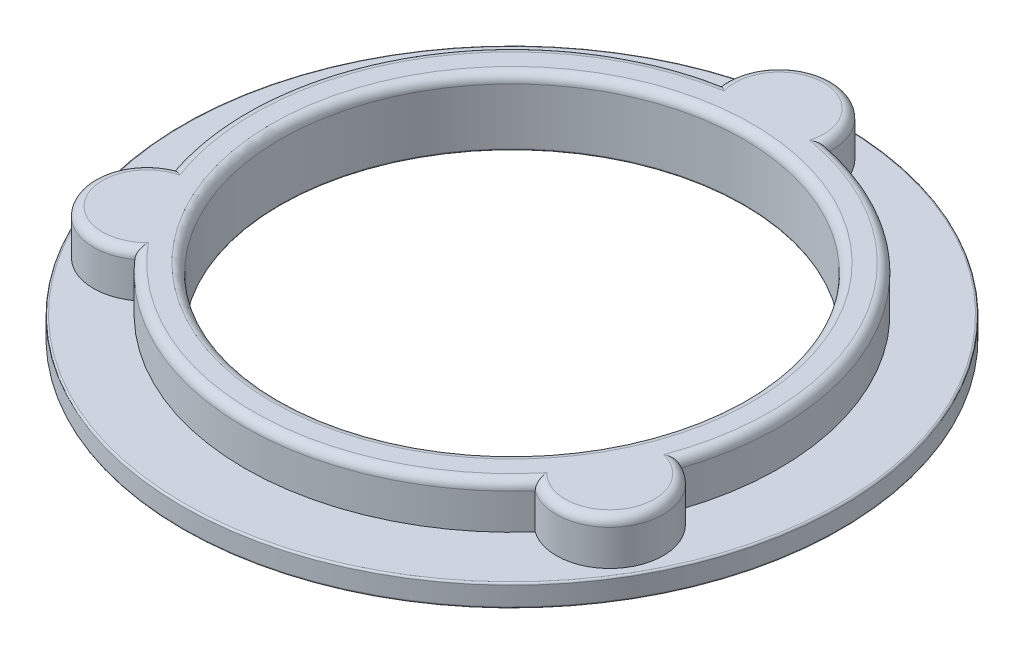
ISO-10303-21;
HEADER;
FILE_DESCRIPTION(('STEP AP214'),'2;1');
FILE_NAME('part.step','',(''),(''),'','','');
FILE_SCHEMA(('AUTOMOTIVE_DESIGN { 1 0 10303 214 1 1 1 1 }'));
ENDSEC;
DATA;
#1=APPLICATION_CONTEXT('core data for automotive mechanical design processes');
#2=APPLICATION_PROTOCOL_DEFINITION('international standard','automotive_design',2000,#1);
#3=PRODUCT_CONTEXT('',#1,'mechanical');
#4=PRODUCT('Part','Part','',(#3));
#5=PRODUCT_RELATED_PRODUCT_CATEGORY('part','',(#4));
#6=PRODUCT_DEFINITION_FORMATION('','',#4);
#7=PRODUCT_DEFINITION_CONTEXT('part definition',#1,'design');
#8=PRODUCT_DEFINITION('design','',#6,#7);
#9=PRODUCT_DEFINITION_SHAPE('','',#8);
#10=(LENGTH_UNIT() NAMED_UNIT(*) SI_UNIT(.MILLI.,.METRE.));
#11=(NAMED_UNIT(*) PLANE_ANGLE_UNIT() SI_UNIT($,.RADIAN.));
#12=(NAMED_UNIT(*) SI_UNIT($,.STERADIAN.) SOLID_ANGLE_UNIT());
#13=UNCERTAINTY_MEASURE_WITH_UNIT(LENGTH_MEASURE(1.E-05),#10,'distance_accuracy_value','');
#14=(GEOMETRIC_REPRESENTATION_CONTEXT(3) GLOBAL_UNCERTAINTY_ASSIGNED_CONTEXT((#13)) GLOBAL_UNIT_ASSIGNED_CONTEXT((#10,
#11,#12)) REPRESENTATION_CONTEXT('',''));
#15=CARTESIAN_POINT('',(0.,0.,0.));
#16=DIRECTION('',(0.,0.,1.));
#17=DIRECTION('',(1.,0.,0.));
#18=AXIS2_PLACEMENT_3D('',#15,#16,#17);
#19=CARTESIAN_POINT('',(0.,1.25,0.));
#20=DIRECTION('',(0.,1.,0.));
#21=DIRECTION('',(0.,0.,1.));
#22=AXIS2_PLACEMENT_3D('',#19,#20,#21);
#23=PLANE('',#22);
#24=CARTESIAN_POINT('',(0.,1.25,0.));
#25=DIRECTION('',(0.,1.,0.));
#26=DIRECTION('',(0.,0.,1.));
#27=AXIS2_PLACEMENT_3D('',#24,#25,#26);
#28=CIRCLE('',#27,18.4);
#29=CARTESIAN_POINT('',(0.,1.25,18.4));
#30=VERTEX_POINT('',#29);
#31=EDGE_CURVE('E51',#30,#30,#28,.T.);
#32=ORIENTED_EDGE('',*,*,#31,.T.);
#33=EDGE_LOOP('',(#32));
#34=FACE_BOUND('',#33,.T.);
#35=CARTESIAN_POINT('',(0.,1.25,0.));
#36=DIRECTION('',(0.,1.,0.));
#37=DIRECTION('',(0.,0.,1.));
#38=AXIS2_PLACEMENT_3D('',#35,#36,#37);
#39=CIRCLE('',#38,15.);
#40=CARTESIAN_POINT('',(-2.98496231131986,1.25,-14.7));
#41=VERTEX_POINT('',#40);
#42=CARTESIAN_POINT('',(-14.2230545912912,1.25,4.76494680905788));
#43=VERTEX_POINT('',#42);
#44=EDGE_CURVE('E117',#41,#43,#39,.T.);
#45=ORIENTED_EDGE('',*,*,#44,.F.);
#46=CARTESIAN_POINT('',(0.,1.25,-15.));
#47=DIRECTION('',(0.,1.,0.));
#48=DIRECTION('',(0.,0.,1.));
#49=AXIS2_PLACEMENT_3D('',#46,#47,#48);
#50=CIRCLE('',#49,3.);
#51=CARTESIAN_POINT('',(2.98496231131986,1.25,-14.7));
#52=VERTEX_POINT('',#51);
#53=EDGE_CURVE('E125',#52,#41,#50,.T.);
#54=ORIENTED_EDGE('',*,*,#53,.F.);
#55=CARTESIAN_POINT('',(14.2230545912912,1.25,4.76494680905789));
#56=VERTEX_POINT('',#55);
#57=EDGE_CURVE('E138',#56,#52,#39,.T.);
#58=ORIENTED_EDGE('',*,*,#57,.F.);
#59=CARTESIAN_POINT('',(12.9903810567666,1.25,7.50000000000001));
#60=DIRECTION('',(0.,1.,0.));
#61=DIRECTION('',(0.,0.,1.));
#62=AXIS2_PLACEMENT_3D('',#59,#60,#61);
#63=CIRCLE('',#62,3.);
#64=CARTESIAN_POINT('',(11.2380922799713,1.25,9.93505319094212));
#65=VERTEX_POINT('',#64);
#66=EDGE_CURVE('E141',#65,#56,#63,.T.);
#67=ORIENTED_EDGE('',*,*,#66,.F.);
#68=CARTESIAN_POINT('',(-11.2380922799713,1.25,9.93505319094212));
#69=VERTEX_POINT('',#68);
#70=EDGE_CURVE('E139',#69,#65,#39,.T.);
#71=ORIENTED_EDGE('',*,*,#70,.F.);
#72=CARTESIAN_POINT('',(-12.9903810567666,1.25,7.5));
#73=DIRECTION('',(0.,1.,0.));
#74=DIRECTION('',(0.,0.,1.));
#75=AXIS2_PLACEMENT_3D('',#72,#73,#74);
#76=CIRCLE('',#75,3.);
#77=EDGE_CURVE('E136',#43,#69,#76,.T.);
#78=ORIENTED_EDGE('',*,*,#77,.F.);
#79=EDGE_LOOP('',(#45,#54,#58,#67,#71,#78));
#80=FACE_BOUND('',#79,.T.);
#81=ADVANCED_FACE('F43',(#34,#80),#23,.T.);
#82=CARTESIAN_POINT('',(0.,0.,0.));
#83=DIRECTION('',(0.,1.,0.));
#84=DIRECTION('',(0.,0.,1.));
#85=AXIS2_PLACEMENT_3D('',#82,#83,#84);
#86=PLANE('',#85);
#87=CARTESIAN_POINT('',(0.,0.,0.));
#88=DIRECTION('',(0.,1.,0.));
#89=DIRECTION('',(0.,0.,1.));
#90=AXIS2_PLACEMENT_3D('',#87,#88,#89);
#91=CIRCLE('',#90,18.4);
#92=CARTESIAN_POINT('',(0.,0.,18.4));
#93=VERTEX_POINT('',#92);
#94=EDGE_CURVE('E264',#93,#93,#91,.F.);
#95=ORIENTED_EDGE('',*,*,#94,.T.);
#96=EDGE_LOOP('',(#95));
#97=FACE_BOUND('',#96,.T.);
#98=CARTESIAN_POINT('',(0.,0.,0.));
#99=DIRECTION('',(0.,1.,0.));
#100=DIRECTION('',(0.,0.,1.));
#101=AXIS2_PLACEMENT_3D('',#98,#99,#100);
#102=CIRCLE('',#101,13.1);
#103=CARTESIAN_POINT('',(0.,0.,13.1));
#104=VERTEX_POINT('',#103);
#105=EDGE_CURVE('E261',#104,#104,#102,.T.);
#106=ORIENTED_EDGE('',*,*,#105,.T.);
#107=EDGE_LOOP('',(#106));
#108=FACE_BOUND('',#107,.T.);
#109=ADVANCED_FACE('F281',(#97,#108),#86,.F.);
#110=CARTESIAN_POINT('',(0.,1.25,0.));
#111=DIRECTION('',(0.,-1.,0.));
#112=DIRECTION('',(0.,0.,-1.));
#113=AXIS2_PLACEMENT_3D('',#110,#111,#112);
#114=CYLINDRICAL_SURFACE('',#113,18.5);
#115=CARTESIAN_POINT('',(0.,0.1,0.));
#116=DIRECTION('',(0.,1.,0.));
#117=DIRECTION('',(0.,0.,1.));
#118=AXIS2_PLACEMENT_3D('',#115,#116,#117);
#119=CIRCLE('',#118,18.5);
#120=CARTESIAN_POINT('',(0.,0.1,18.5));
#121=VERTEX_POINT('',#120);
#122=EDGE_CURVE('E258',#121,#121,#119,.T.);
#123=ORIENTED_EDGE('',*,*,#122,.T.);
#124=EDGE_LOOP('',(#123));
#125=FACE_BOUND('',#124,.T.);
#126=CARTESIAN_POINT('',(0.,1.15,0.));
#127=DIRECTION('',(0.,1.,0.));
#128=DIRECTION('',(0.,0.,1.));
#129=AXIS2_PLACEMENT_3D('',#126,#127,#128);
#130=CIRCLE('',#129,18.5);
#131=CARTESIAN_POINT('',(0.,1.15,18.5));
#132=VERTEX_POINT('',#131);
#133=EDGE_CURVE('E188',#132,#132,#130,.F.);
#134=ORIENTED_EDGE('',*,*,#133,.T.);
#135=EDGE_LOOP('',(#134));
#136=FACE_BOUND('',#135,.T.);
#137=ADVANCED_FACE('F286',(#125,#136),#114,.T.);
#138=CARTESIAN_POINT('',(0.,1.25,0.));
#139=DIRECTION('',(0.,-1.,0.));
#140=DIRECTION('',(0.,0.,-1.));
#141=AXIS2_PLACEMENT_3D('',#138,#139,#140);
#142=CYLINDRICAL_SURFACE('',#141,13.);
#143=CARTESIAN_POINT('',(0.,0.1,0.));
#144=DIRECTION('',(0.,1.,0.));
#145=DIRECTION('',(0.,0.,1.));
#146=AXIS2_PLACEMENT_3D('',#143,#144,#145);
#147=CIRCLE('',#146,13.);
#148=CARTESIAN_POINT('',(0.,0.1,13.));
#149=VERTEX_POINT('',#148);
#150=EDGE_CURVE('E11',#149,#149,#147,.F.);
#151=ORIENTED_EDGE('',*,*,#150,.T.);
#152=EDGE_LOOP('',(#151));
#153=FACE_BOUND('',#152,.T.);
#154=CARTESIAN_POINT('',(0.,3.25,0.));
#155=DIRECTION('',(0.,1.,0.));
#156=DIRECTION('',(0.,0.,1.));
#157=AXIS2_PLACEMENT_3D('',#154,#155,#156);
#158=CIRCLE('',#157,13.);
#159=CARTESIAN_POINT('',(0.,3.25,13.));
#160=VERTEX_POINT('',#159);
#161=EDGE_CURVE('E174',#160,#160,#158,.T.);
#162=ORIENTED_EDGE('',*,*,#161,.T.);
#163=EDGE_LOOP('',(#162));
#164=FACE_BOUND('',#163,.T.);
#165=ADVANCED_FACE('F290',(#153,#164),#142,.F.);
#166=CARTESIAN_POINT('',(0.,3.75,-15.));
#167=DIRECTION('',(0.,-1.,0.));
#168=DIRECTION('',(0.,0.,-1.));
#169=AXIS2_PLACEMENT_3D('',#166,#167,#168);
#170=CYLINDRICAL_SURFACE('',#169,3.);
#171=DIRECTION('',(0.,-1.,0.));
#172=VECTOR('',#171,1.);
#173=CARTESIAN_POINT('',(-2.98496231131986,3.75,-14.7));
#174=LINE('',#173,#172);
#175=CARTESIAN_POINT('',(-2.98496231131986,3.25,-14.7));
#176=VERTEX_POINT('',#175);
#177=EDGE_CURVE('E113',#176,#41,#174,.T.);
#178=ORIENTED_EDGE('',*,*,#177,.F.);
#179=CARTESIAN_POINT('',(0.,3.25,-15.));
#180=DIRECTION('',(0.,1.,0.));
#181=DIRECTION('',(0.,0.,1.));
#182=AXIS2_PLACEMENT_3D('',#179,#180,#181);
#183=CIRCLE('',#182,3.);
#184=CARTESIAN_POINT('',(2.98496231131986,3.25,-14.7));
#185=VERTEX_POINT('',#184);
#186=EDGE_CURVE('E186',#176,#185,#183,.F.);
#187=ORIENTED_EDGE('',*,*,#186,.T.);
#188=DIRECTION('',(0.,-1.,0.));
#189=VECTOR('',#188,1.);
#190=CARTESIAN_POINT('',(2.98496231131986,3.75,-14.7));
#191=LINE('',#190,#189);
#192=EDGE_CURVE('E128',#185,#52,#191,.T.);
#193=ORIENTED_EDGE('',*,*,#192,.T.);
#194=ORIENTED_EDGE('',*,*,#53,.T.);
#195=EDGE_LOOP('',(#178,#187,#193,#194));
#196=FACE_BOUND('',#195,.T.);
#197=ADVANCED_FACE('F126',(#196),#170,.T.);
#198=CARTESIAN_POINT('',(0.,3.75,0.));
#199=DIRECTION('',(0.,-1.,0.));
#200=DIRECTION('',(0.,0.,-1.));
#201=AXIS2_PLACEMENT_3D('',#198,#199,#200);
#202=CYLINDRICAL_SURFACE('',#201,15.);
#203=DIRECTION('',(0.,-1.,0.));
#204=VECTOR('',#203,1.);
#205=CARTESIAN_POINT('',(-14.2230545912912,3.75,4.76494680905788));
#206=LINE('',#205,#204);
#207=CARTESIAN_POINT('',(-14.2230545912912,3.25,4.76494680905788));
#208=VERTEX_POINT('',#207);
#209=EDGE_CURVE('E122',#208,#43,#206,.T.);
#210=ORIENTED_EDGE('',*,*,#209,.F.);
#211=CARTESIAN_POINT('',(0.,3.25,0.));
#212=DIRECTION('',(0.,1.,0.));
#213=DIRECTION('',(0.,0.,1.));
#214=AXIS2_PLACEMENT_3D('',#211,#212,#213);
#215=CIRCLE('',#214,15.);
#216=EDGE_CURVE('E58',#208,#176,#215,.F.);
#217=ORIENTED_EDGE('',*,*,#216,.T.);
#218=ORIENTED_EDGE('',*,*,#177,.T.);
#219=ORIENTED_EDGE('',*,*,#44,.T.);
#220=EDGE_LOOP('',(#210,#217,#218,#219));
#221=FACE_BOUND('',#220,.T.);
#222=ADVANCED_FACE('F115',(#221),#202,.T.);
#223=CARTESIAN_POINT('',(-12.9903810567666,3.75,7.5));
#224=DIRECTION('',(0.,-1.,0.));
#225=DIRECTION('',(0.,0.,-1.));
#226=AXIS2_PLACEMENT_3D('',#223,#224,#225);
#227=CYLINDRICAL_SURFACE('',#226,3.);
#228=DIRECTION('',(0.,-1.,0.));
#229=VECTOR('',#228,1.);
#230=CARTESIAN_POINT('',(-11.2380922799713,3.75,9.93505319094212));
#231=LINE('',#230,#229);
#232=CARTESIAN_POINT('',(-11.2380922799713,3.25,9.93505319094212));
#233=VERTEX_POINT('',#232);
#234=EDGE_CURVE('E156',#233,#69,#231,.T.);
#235=ORIENTED_EDGE('',*,*,#234,.F.);
#236=CARTESIAN_POINT('',(-12.9903810567666,3.25,7.5));
#237=DIRECTION('',(0.,1.,0.));
#238=DIRECTION('',(0.,0.,1.));
#239=AXIS2_PLACEMENT_3D('',#236,#237,#238);
#240=CIRCLE('',#239,3.);
#241=EDGE_CURVE('E66',#233,#208,#240,.F.);
#242=ORIENTED_EDGE('',*,*,#241,.T.);
#243=ORIENTED_EDGE('',*,*,#209,.T.);
#244=ORIENTED_EDGE('',*,*,#77,.T.);
#245=EDGE_LOOP('',(#235,#242,#243,#244));
#246=FACE_BOUND('',#245,.T.);
#247=ADVANCED_FACE('F331',(#246),#227,.T.);
#248=DIRECTION('',(0.,-1.,0.));
#249=VECTOR('',#248,1.);
#250=CARTESIAN_POINT('',(11.2380922799713,3.75,9.93505319094212));
#251=LINE('',#250,#249);
#252=CARTESIAN_POINT('',(11.2380922799713,3.25,9.93505319094212));
#253=VERTEX_POINT('',#252);
#254=EDGE_CURVE('E154',#253,#65,#251,.T.);
#255=ORIENTED_EDGE('',*,*,#254,.F.);
#256=CARTESIAN_POINT('',(0.,3.25,0.));
#257=DIRECTION('',(0.,1.,0.));
#258=DIRECTION('',(0.,0.,1.));
#259=AXIS2_PLACEMENT_3D('',#256,#257,#258);
#260=CIRCLE('',#259,15.);
#261=EDGE_CURVE('E182',#253,#233,#260,.F.);
#262=ORIENTED_EDGE('',*,*,#261,.T.);
#263=ORIENTED_EDGE('',*,*,#234,.T.);
#264=ORIENTED_EDGE('',*,*,#70,.T.);
#265=EDGE_LOOP('',(#255,#262,#263,#264));
#266=FACE_BOUND('',#265,.T.);
#267=ADVANCED_FACE('F330',(#266),#202,.T.);
#268=CARTESIAN_POINT('',(12.9903810567666,3.75,7.50000000000001));
#269=DIRECTION('',(0.,-1.,0.));
#270=DIRECTION('',(0.,0.,-1.));
#271=AXIS2_PLACEMENT_3D('',#268,#269,#270);
#272=CYLINDRICAL_SURFACE('',#271,3.);
#273=DIRECTION('',(0.,-1.,0.));
#274=VECTOR('',#273,1.);
#275=CARTESIAN_POINT('',(14.2230545912912,3.75,4.76494680905789));
#276=LINE('',#275,#274);
#277=CARTESIAN_POINT('',(14.2230545912912,3.25,4.76494680905789));
#278=VERTEX_POINT('',#277);
#279=EDGE_CURVE('E152',#278,#56,#276,.T.);
#280=ORIENTED_EDGE('',*,*,#279,.F.);
#281=CARTESIAN_POINT('',(12.9903810567666,3.25,7.50000000000001));
#282=DIRECTION('',(0.,1.,0.));
#283=DIRECTION('',(0.,0.,1.));
#284=AXIS2_PLACEMENT_3D('',#281,#282,#283);
#285=CIRCLE('',#284,3.);
#286=EDGE_CURVE('E180',#278,#253,#285,.F.);
#287=ORIENTED_EDGE('',*,*,#286,.T.);
#288=ORIENTED_EDGE('',*,*,#254,.T.);
#289=ORIENTED_EDGE('',*,*,#66,.T.);
#290=EDGE_LOOP('',(#280,#287,#288,#289));
#291=FACE_BOUND('',#290,.T.);
#292=ADVANCED_FACE('F333',(#291),#272,.T.);
#293=ORIENTED_EDGE('',*,*,#192,.F.);
#294=CARTESIAN_POINT('',(0.,3.25,0.));
#295=DIRECTION('',(0.,1.,0.));
#296=DIRECTION('',(0.,0.,1.));
#297=AXIS2_PLACEMENT_3D('',#294,#295,#296);
#298=CIRCLE('',#297,15.);
#299=EDGE_CURVE('E177',#185,#278,#298,.F.);
#300=ORIENTED_EDGE('',*,*,#299,.T.);
#301=ORIENTED_EDGE('',*,*,#279,.T.);
#302=ORIENTED_EDGE('',*,*,#57,.T.);
#303=EDGE_LOOP('',(#293,#300,#301,#302));
#304=FACE_BOUND('',#303,.T.);
#305=ADVANCED_FACE('F304',(#304),#202,.T.);
#306=CARTESIAN_POINT('',(0.,3.75,0.));
#307=DIRECTION('',(0.,1.,0.));
#308=DIRECTION('',(0.,0.,1.));
#309=AXIS2_PLACEMENT_3D('',#306,#307,#308);
#310=PLANE('',#309);
#311=CARTESIAN_POINT('',(0.,3.75,0.));
#312=DIRECTION('',(0.,1.,0.));
#313=DIRECTION('',(0.,0.,1.));
#314=AXIS2_PLACEMENT_3D('',#311,#312,#313);
#315=CIRCLE('',#314,13.5);
#316=CARTESIAN_POINT('',(0.,3.75,13.5));
#317=VERTEX_POINT('',#316);
#318=EDGE_CURVE('E171',#317,#317,#315,.F.);
#319=ORIENTED_EDGE('',*,*,#318,.T.);
#320=EDGE_LOOP('',(#319));
#321=FACE_BOUND('',#320,.T.);
#322=CARTESIAN_POINT('',(12.9903810567666,3.75,7.50000000000001));
#323=DIRECTION('',(0.,1.,0.));
#324=DIRECTION('',(0.,0.,1.));
#325=AXIS2_PLACEMENT_3D('',#322,#323,#324);
#326=CIRCLE('',#325,2.5);
#327=CARTESIAN_POINT('',(11.1841632741175,3.75,9.22846096908266));
#328=VERTEX_POINT('',#327);
#329=CARTESIAN_POINT('',(13.5841632741175,3.75,5.07153903091735));
#330=VERTEX_POINT('',#329);
#331=EDGE_CURVE('E166',#328,#330,#326,.T.);
#332=ORIENTED_EDGE('',*,*,#331,.T.);
#333=CARTESIAN_POINT('',(0.,3.75,0.));
#334=DIRECTION('',(0.,1.,0.));
#335=DIRECTION('',(0.,0.,1.));
#336=AXIS2_PLACEMENT_3D('',#333,#334,#335);
#337=CIRCLE('',#336,14.5);
#338=CARTESIAN_POINT('',(2.4,3.75,-14.3));
#339=VERTEX_POINT('',#338);
#340=EDGE_CURVE('E168',#330,#339,#337,.T.);
#341=ORIENTED_EDGE('',*,*,#340,.T.);
#342=CARTESIAN_POINT('',(0.,3.75,-15.));
#343=DIRECTION('',(0.,1.,0.));
#344=DIRECTION('',(0.,0.,1.));
#345=AXIS2_PLACEMENT_3D('',#342,#343,#344);
#346=CIRCLE('',#345,2.5);
#347=CARTESIAN_POINT('',(-2.4,3.75,-14.3));
#348=VERTEX_POINT('',#347);
#349=EDGE_CURVE('E121',#339,#348,#346,.T.);
#350=ORIENTED_EDGE('',*,*,#349,.T.);
#351=CARTESIAN_POINT('',(0.,3.75,0.));
#352=DIRECTION('',(0.,1.,0.));
#353=DIRECTION('',(0.,0.,1.));
#354=AXIS2_PLACEMENT_3D('',#351,#352,#353);
#355=CIRCLE('',#354,14.5);
#356=CARTESIAN_POINT('',(-13.5841632741175,3.75,5.07153903091735));
#357=VERTEX_POINT('',#356);
#358=EDGE_CURVE('E160',#348,#357,#355,.T.);
#359=ORIENTED_EDGE('',*,*,#358,.T.);
#360=CARTESIAN_POINT('',(-12.9903810567666,3.75,7.5));
#361=DIRECTION('',(0.,1.,0.));
#362=DIRECTION('',(0.,0.,1.));
#363=AXIS2_PLACEMENT_3D('',#360,#361,#362);
#364=CIRCLE('',#363,2.5);
#365=CARTESIAN_POINT('',(-11.1841632741175,3.75,9.22846096908265));
#366=VERTEX_POINT('',#365);
#367=EDGE_CURVE('E162',#357,#366,#364,.T.);
#368=ORIENTED_EDGE('',*,*,#367,.T.);
#369=CARTESIAN_POINT('',(0.,3.75,0.));
#370=DIRECTION('',(0.,1.,0.));
#371=DIRECTION('',(0.,0.,1.));
#372=AXIS2_PLACEMENT_3D('',#369,#370,#371);
#373=CIRCLE('',#372,14.5);
#374=EDGE_CURVE('E164',#366,#328,#373,.T.);
#375=ORIENTED_EDGE('',*,*,#374,.T.);
#376=EDGE_LOOP('',(#332,#341,#350,#359,#368,#375));
#377=FACE_BOUND('',#376,.T.);
#378=ADVANCED_FACE('F297',(#321,#377),#310,.T.);
#379=CARTESIAN_POINT('',(0.,3.25,0.));
#380=DIRECTION('',(0.,1.,0.));
#381=DIRECTION('',(0.,0.,1.));
#382=AXIS2_PLACEMENT_3D('',#379,#380,#381);
#383=TOROIDAL_SURFACE('',#382,13.5,0.5);
#384=ORIENTED_EDGE('',*,*,#161,.F.);
#385=EDGE_LOOP('',(#384));
#386=FACE_BOUND('',#385,.T.);
#387=ORIENTED_EDGE('',*,*,#318,.F.);
#388=EDGE_LOOP('',(#387));
#389=FACE_BOUND('',#388,.T.);
#390=ADVANCED_FACE('F295',(#386,#389),#383,.T.);
#391=CARTESIAN_POINT('',(-12.9903810567666,3.25,7.5));
#392=DIRECTION('',(0.,1.,0.));
#393=DIRECTION('',(0.,0.,1.));
#394=AXIS2_PLACEMENT_3D('',#391,#392,#393);
#395=TOROIDAL_SURFACE('',#394,2.5,0.5);
#396=CARTESIAN_POINT('',(-14.2230545912912,3.25,4.76494680905788));
#397=CARTESIAN_POINT('',(-14.2230986461439,3.27290086483907,4.76492990888611));
#398=CARTESIAN_POINT('',(-14.2211138308867,3.29575667348987,4.76579502583605));
#399=CARTESIAN_POINT('',(-14.2134596538504,3.34055664061278,4.76914439087959));
#400=CARTESIAN_POINT('',(-14.2078170215838,3.36250619346143,4.77161689336964));
#401=CARTESIAN_POINT('',(-14.1932254125643,3.4049798030937,4.77803340928666));
#402=CARTESIAN_POINT('',(-14.1842830211207,3.42550660299374,4.78197449203007));
#403=CARTESIAN_POINT('',(-14.1636029555722,3.46481428076269,4.79113292590585));
#404=CARTESIAN_POINT('',(-14.1518602708362,3.483591944133,4.79635256525));
#405=CARTESIAN_POINT('',(-14.1217057976028,3.52523021394123,4.80983499670384));
#406=CARTESIAN_POINT('',(-14.1023861857811,3.54729384761773,4.81852821545387));
#407=CARTESIAN_POINT('',(-14.0608157544754,3.58769304181867,4.83741178838195));
#408=CARTESIAN_POINT('',(-14.0385600954145,3.60602231712821,4.84760461768187));
#409=CARTESIAN_POINT('',(-13.98361583311,3.64503617883405,4.87303707983409));
#410=CARTESIAN_POINT('',(-13.9500635049846,3.66417812283979,4.88876937102916));
#411=CARTESIAN_POINT('',(-13.8808575057951,3.6963343188024,4.92174850481847));
#412=CARTESIAN_POINT('',(-13.8452008316324,3.70933956297362,4.93899753000377));
#413=CARTESIAN_POINT('',(-13.7727149351567,3.72988073156558,4.97467332239883));
#414=CARTESIAN_POINT('',(-13.7358806893475,3.73738862518475,4.99310561147649));
#415=CARTESIAN_POINT('',(-13.6620141574801,3.74735691379744,5.03074953772216));
#416=CARTESIAN_POINT('',(-13.6249823153393,3.74982588023516,5.04995979465086));
#417=CARTESIAN_POINT('',(-13.5868075921788,3.7499970325172,5.07013977374813));
#418=CARTESIAN_POINT('',(-13.5854853103202,3.74999999493496,5.07083923116504));
#419=CARTESIAN_POINT('',(-13.5841632741175,3.75,5.07153903091735));
#420=B_SPLINE_CURVE_WITH_KNOTS('',3,(#396,#397,#398,#399,#400,#401,#402,#403,#404,#405,#406,
#407,#408,#409,#410,#411,#412,#413,#414,#415,#416,#417,#418,#419),.UNSPECIFIED.,.F.,.F.,(4,2,2,
2,2,2,2,2,2,2,2,4),(0.,0.0685290676804235,0.136562919548023,0.204461724580458,0.272482946400405,
0.363744339565082,0.455158086432357,0.579607636059306,0.704239295655403,0.82950210463092,
0.954551657678308,0.959039304009293),.UNSPECIFIED.);
#421=EDGE_CURVE('E230',#208,#357,#420,.T.);
#422=ORIENTED_EDGE('',*,*,#421,.F.);
#423=ORIENTED_EDGE('',*,*,#241,.F.);
#424=CARTESIAN_POINT('',(-11.2380922799713,3.25,9.93505319094212));
#425=CARTESIAN_POINT('',(-11.2380996714196,3.27290086483907,9.93509979364961));
#426=CARTESIAN_POINT('',(-11.2378564770469,3.29575667348987,9.9329483347401));
#427=CARTESIAN_POINT('',(-11.236930023743,3.34055664061278,9.92464494045979));
#428=CARTESIAN_POINT('',(-11.236249957577,3.36250619346143,9.91852202632771));
#429=CARTESIAN_POINT('',(-11.2345110188552,3.4049798030937,9.90267706427619));
#430=CARTESIAN_POINT('',(-11.2334529009076,3.42550660299374,9.89296218474377));
#431=CARTESIAN_POINT('',(-11.2310443045286,3.46481428076269,9.87047350568893));
#432=CARTESIAN_POINT('',(-11.2296933024313,3.483591944133,9.85769422272688));
#433=CARTESIAN_POINT('',(-11.2262921939584,3.52523021394122,9.82483846714211));
#434=CARTESIAN_POINT('',(-11.2241609363257,3.54729384761773,9.80376058313819));
#435=CARTESIAN_POINT('',(-11.2197293745428,3.58769304181867,9.75831774711718));
#436=CARTESIAN_POINT('',(-11.2174287941225,3.60602231712821,9.73394736634249));
#437=CARTESIAN_POINT('',(-11.2119818212748,3.64503617883405,9.67364800831849));
#438=CARTESIAN_POINT('',(-11.2088302210468,3.66417812283979,9.63672469420825));
#439=CARTESIAN_POINT('',(-11.2027879891084,3.6963343188024,9.56030097392125));
#440=CARTESIAN_POINT('',(-11.1998977460281,3.70933956297362,9.52079687568922));
#441=CARTESIAN_POINT('',(-11.1945509403045,3.72988073156558,9.44018435172759));
#442=CARTESIAN_POINT('',(-11.1920966479911,3.73738862518475,9.39906881458883));
#443=CARTESIAN_POINT('',(-11.1877639784843,3.74735691379744,9.31627655837938));
#444=CARTESIAN_POINT('',(-11.1858846279273,3.74982588023516,9.27460091387216));
#445=CARTESIAN_POINT('',(-11.1842736408932,3.7499970325172,9.23145064428408));
#446=CARTESIAN_POINT('',(-11.1842182478558,3.74999999493496,9.22995578589511));
#447=CARTESIAN_POINT('',(-11.1841632741175,3.75,9.22846096908265));
#448=B_SPLINE_CURVE_WITH_KNOTS('',3,(#424,#425,#426,#427,#428,#429,#430,#431,#432,#433,#434,
#435,#436,#437,#438,#439,#440,#441,#442,#443,#444,#445,#446,#447),.UNSPECIFIED.,.F.,.F.,(4,2,2,
2,2,2,2,2,2,2,2,4),(0.,0.0685290676804226,0.136562919548023,0.204461724580459,0.272482946400404,
0.363744339565082,0.455158086432357,0.579607636059307,0.704239295655403,0.829502104630918,
0.954551657678307,0.959039304009293),.UNSPECIFIED.);
#449=EDGE_CURVE('E132',#366,#233,#448,.F.);
#450=ORIENTED_EDGE('',*,*,#449,.F.);
#451=ORIENTED_EDGE('',*,*,#367,.F.);
#452=EDGE_LOOP('',(#422,#423,#450,#451));
#453=FACE_BOUND('',#452,.T.);
#454=ADVANCED_FACE('F245',(#453),#395,.T.);
#455=CARTESIAN_POINT('',(0.,3.25,0.));
#456=DIRECTION('',(0.,1.,0.));
#457=DIRECTION('',(0.,0.,1.));
#458=AXIS2_PLACEMENT_3D('',#455,#456,#457);
#459=TOROIDAL_SURFACE('',#458,14.5,0.5);
#460=ORIENTED_EDGE('',*,*,#449,.T.);
#461=ORIENTED_EDGE('',*,*,#261,.F.);
#462=CARTESIAN_POINT('',(11.2380922799713,3.25,9.93505319094212));
#463=CARTESIAN_POINT('',(11.2380996714196,3.27290086483907,9.93509979364962));
#464=CARTESIAN_POINT('',(11.2378564770469,3.29575667348987,9.93294833474011));
#465=CARTESIAN_POINT('',(11.236930023743,3.34055664061278,9.9246449404598));
#466=CARTESIAN_POINT('',(11.236249957577,3.36250619346143,9.91852202632772));
#467=CARTESIAN_POINT('',(11.2345110188551,3.4049798030937,9.9026770642762));
#468=CARTESIAN_POINT('',(11.2334529009076,3.42550660299374,9.89296218474378));
#469=CARTESIAN_POINT('',(11.2310443045286,3.46481428076269,9.87047350568894));
#470=CARTESIAN_POINT('',(11.2296933024313,3.483591944133,9.85769422272689));
#471=CARTESIAN_POINT('',(11.2262921939584,3.52523021394122,9.82483846714211));
#472=CARTESIAN_POINT('',(11.2241609363257,3.54729384761773,9.8037605831382));
#473=CARTESIAN_POINT('',(11.2197293745428,3.58769304181867,9.75831774711719));
#474=CARTESIAN_POINT('',(11.2174287941225,3.60602231712821,9.7339473663425));
#475=CARTESIAN_POINT('',(11.2119818212748,3.64503617883405,9.67364800831851));
#476=CARTESIAN_POINT('',(11.2088302210468,3.66417812283979,9.63672469420826));
#477=CARTESIAN_POINT('',(11.2027879891084,3.69633431880239,9.56030097392127));
#478=CARTESIAN_POINT('',(11.1998977460281,3.70933956297362,9.52079687568924));
#479=CARTESIAN_POINT('',(11.1945509403044,3.72988073156558,9.44018435172761));
#480=CARTESIAN_POINT('',(11.192096647991,3.73738862518475,9.39906881458884));
#481=CARTESIAN_POINT('',(11.1877639784843,3.74735691379744,9.31627655837939));
#482=CARTESIAN_POINT('',(11.1858846279273,3.74982588023516,9.27460091387217));
#483=CARTESIAN_POINT('',(11.1842736408932,3.7499970325172,9.23145064428409));
#484=CARTESIAN_POINT('',(11.1842182478558,3.74999999493496,9.22995578589512));
#485=CARTESIAN_POINT('',(11.1841632741175,3.75,9.22846096908266));
#486=B_SPLINE_CURVE_WITH_KNOTS('',3,(#462,#463,#464,#465,#466,#467,#468,#469,#470,#471,#472,
#473,#474,#475,#476,#477,#478,#479,#480,#481,#482,#483,#484,#485),.UNSPECIFIED.,.F.,.F.,(4,2,2,
2,2,2,2,2,2,2,2,4),(0.,0.0685290676804231,0.136562919548023,0.204461724580457,0.272482946400403,
0.36374433956508,0.455158086432353,0.579607636059301,0.704239295655397,0.829502104630914,
0.954551657678305,0.959039304009293),.UNSPECIFIED.);
#487=EDGE_CURVE('E223',#328,#253,#486,.F.);
#488=ORIENTED_EDGE('',*,*,#487,.F.);
#489=ORIENTED_EDGE('',*,*,#374,.F.);
#490=EDGE_LOOP('',(#460,#461,#488,#489));
#491=FACE_BOUND('',#490,.T.);
#492=ADVANCED_FACE('F242',(#491),#459,.T.);
#493=CARTESIAN_POINT('',(0.,3.25,0.));
#494=DIRECTION('',(0.,1.,0.));
#495=DIRECTION('',(0.,0.,1.));
#496=AXIS2_PLACEMENT_3D('',#493,#494,#495);
#497=TOROIDAL_SURFACE('',#496,14.5,0.5);
#498=ORIENTED_EDGE('',*,*,#421,.T.);
#499=ORIENTED_EDGE('',*,*,#358,.F.);
#500=CARTESIAN_POINT('',(-2.98496231131986,3.25,-14.7));
#501=CARTESIAN_POINT('',(-2.98499897472431,3.27290086483907,-14.7000297025357));
#502=CARTESIAN_POINT('',(-2.98325735383982,3.29575667348987,-14.6987433605762));
#503=CARTESIAN_POINT('',(-2.9765296301074,3.34055664061278,-14.6937893313394));
#504=CARTESIAN_POINT('',(-2.97156706400681,3.36250619346143,-14.6901389196973));
#505=CARTESIAN_POINT('',(-2.95871439370912,3.4049798030937,-14.6807104735629));
#506=CARTESIAN_POINT('',(-2.95083012021313,3.42550660299374,-14.6749366767738));
#507=CARTESIAN_POINT('',(-2.93255865104355,3.46481428076269,-14.6616064315948));
#508=CARTESIAN_POINT('',(-2.92216696840495,3.483591944133,-14.6540467879769));
#509=CARTESIAN_POINT('',(-2.89541360364444,3.52523021394123,-14.6346734638459));
#510=CARTESIAN_POINT('',(-2.87822524945538,3.54729384761773,-14.6222887985921));
#511=CARTESIAN_POINT('',(-2.84108637993262,3.58769304181867,-14.5957295354991));
#512=CARTESIAN_POINT('',(-2.82113130129199,3.60602231712821,-14.5815519840244));
#513=CARTESIAN_POINT('',(-2.77163401183514,3.64503617883405,-14.5466850881526));
#514=CARTESIAN_POINT('',(-2.74123328393777,3.66417812283979,-14.5254940652374));
#515=CARTESIAN_POINT('',(-2.6780695166867,3.6963343188024,-14.4820494787397));
#516=CARTESIAN_POINT('',(-2.64530308560436,3.70933956297362,-14.459794405693));
#517=CARTESIAN_POINT('',(-2.5781639948522,3.72988073156558,-14.4148576741264));
#518=CARTESIAN_POINT('',(-2.54378404135649,3.73738862518475,-14.3921744260653));
#519=CARTESIAN_POINT('',(-2.47425017899587,3.74735691379744,-14.3470260961015));
#520=CARTESIAN_POINT('',(-2.43909768741202,3.74982588023516,-14.3245607085229));
#521=CARTESIAN_POINT('',(-2.40253395128565,3.7499970325172,-14.3015904180322));
#522=CARTESIAN_POINT('',(-2.40126706246444,3.74999999493496,-14.3007950170601));
#523=CARTESIAN_POINT('',(-2.4,3.75,-14.3));
#524=B_SPLINE_CURVE_WITH_KNOTS('',3,(#500,#501,#502,#503,#504,#505,#506,#507,#508,#509,#510,
#511,#512,#513,#514,#515,#516,#517,#518,#519,#520,#521,#522,#523),.UNSPECIFIED.,.F.,.F.,(4,2,2,
2,2,2,2,2,2,2,2,4),(0.,0.0685290676804232,0.136562919548023,0.204461724580458,0.272482946400404,
0.363744339565083,0.455158086432357,0.579607636059307,0.704239295655405,0.829502104630921,
0.954551657678307,0.959039304009293),.UNSPECIFIED.);
#525=EDGE_CURVE('E231',#176,#348,#524,.T.);
#526=ORIENTED_EDGE('',*,*,#525,.F.);
#527=ORIENTED_EDGE('',*,*,#216,.F.);
#528=EDGE_LOOP('',(#498,#499,#526,#527));
#529=FACE_BOUND('',#528,.T.);
#530=ADVANCED_FACE('F217',(#529),#497,.T.);
#531=CARTESIAN_POINT('',(12.9903810567666,3.25,7.50000000000001));
#532=DIRECTION('',(0.,1.,0.));
#533=DIRECTION('',(0.,0.,1.));
#534=AXIS2_PLACEMENT_3D('',#531,#532,#533);
#535=TOROIDAL_SURFACE('',#534,2.5,0.5);
#536=ORIENTED_EDGE('',*,*,#487,.T.);
#537=ORIENTED_EDGE('',*,*,#286,.F.);
#538=CARTESIAN_POINT('',(14.2230545912912,3.25,4.76494680905789));
#539=CARTESIAN_POINT('',(14.2230986461439,3.27290086483907,4.76492990888611));
#540=CARTESIAN_POINT('',(14.2211138308867,3.29575667348987,4.76579502583606));
#541=CARTESIAN_POINT('',(14.2134596538504,3.34055664061278,4.76914439087959));
#542=CARTESIAN_POINT('',(14.2078170215838,3.36250619346143,4.77161689336964));
#543=CARTESIAN_POINT('',(14.1932254125643,3.4049798030937,4.77803340928666));
#544=CARTESIAN_POINT('',(14.1842830211207,3.42550660299374,4.78197449203007));
#545=CARTESIAN_POINT('',(14.1636029555722,3.46481428076269,4.79113292590585));
#546=CARTESIAN_POINT('',(14.1518602708362,3.483591944133,4.79635256525));
#547=CARTESIAN_POINT('',(14.1217057976028,3.52523021394122,4.80983499670384));
#548=CARTESIAN_POINT('',(14.1023861857811,3.54729384761773,4.81852821545387));
#549=CARTESIAN_POINT('',(14.0608157544754,3.58769304181867,4.83741178838195));
#550=CARTESIAN_POINT('',(14.0385600954145,3.60602231712821,4.84760461768187));
#551=CARTESIAN_POINT('',(13.98361583311,3.64503617883405,4.87303707983409));
#552=CARTESIAN_POINT('',(13.9500635049846,3.66417812283979,4.88876937102916));
#553=CARTESIAN_POINT('',(13.8808575057951,3.69633431880239,4.92174850481847));
#554=CARTESIAN_POINT('',(13.8452008316324,3.70933956297362,4.93899753000377));
#555=CARTESIAN_POINT('',(13.7727149351567,3.72988073156558,4.97467332239883));
#556=CARTESIAN_POINT('',(13.7358806893475,3.73738862518475,4.99310561147648));
#557=CARTESIAN_POINT('',(13.6620141574801,3.74735691379744,5.03074953772216));
#558=CARTESIAN_POINT('',(13.6249823153393,3.74982588023516,5.04995979465088));
#559=CARTESIAN_POINT('',(13.5868075921788,3.7499970325172,5.07013977374813));
#560=CARTESIAN_POINT('',(13.5854853103202,3.74999999493496,5.07083923116504));
#561=CARTESIAN_POINT('',(13.5841632741175,3.75,5.07153903091735));
#562=B_SPLINE_CURVE_WITH_KNOTS('',3,(#538,#539,#540,#541,#542,#543,#544,#545,#546,#547,#548,
#549,#550,#551,#552,#553,#554,#555,#556,#557,#558,#559,#560,#561),.UNSPECIFIED.,.F.,.F.,(4,2,2,
2,2,2,2,2,2,2,2,4),(0.,0.0685290676804235,0.136562919548023,0.204461724580458,0.272482946400405,
0.363744339565081,0.455158086432354,0.579607636059303,0.704239295655399,0.829502104630918,
0.954551657678307,0.959039304009293),.UNSPECIFIED.);
#563=EDGE_CURVE('E197',#330,#278,#562,.F.);
#564=ORIENTED_EDGE('',*,*,#563,.F.);
#565=ORIENTED_EDGE('',*,*,#331,.F.);
#566=EDGE_LOOP('',(#536,#537,#564,#565));
#567=FACE_BOUND('',#566,.T.);
#568=ADVANCED_FACE('F212',(#567),#535,.T.);
#569=CARTESIAN_POINT('',(0.,3.25,-15.));
#570=DIRECTION('',(0.,1.,0.));
#571=DIRECTION('',(0.,0.,1.));
#572=AXIS2_PLACEMENT_3D('',#569,#570,#571);
#573=TOROIDAL_SURFACE('',#572,2.5,0.5);
#574=ORIENTED_EDGE('',*,*,#525,.T.);
#575=ORIENTED_EDGE('',*,*,#349,.F.);
#576=CARTESIAN_POINT('',(2.98496231131986,3.25,-14.7));
#577=CARTESIAN_POINT('',(2.98499897472431,3.27290086483907,-14.7000297025357));
#578=CARTESIAN_POINT('',(2.98325735383982,3.29575667348987,-14.6987433605762));
#579=CARTESIAN_POINT('',(2.9765296301074,3.34055664061278,-14.6937893313394));
#580=CARTESIAN_POINT('',(2.97156706400681,3.36250619346143,-14.6901389196973));
#581=CARTESIAN_POINT('',(2.95871439370912,3.4049798030937,-14.6807104735629));
#582=CARTESIAN_POINT('',(2.95083012021313,3.42550660299374,-14.6749366767738));
#583=CARTESIAN_POINT('',(2.93255865104355,3.46481428076269,-14.6616064315948));
#584=CARTESIAN_POINT('',(2.92216696840495,3.483591944133,-14.6540467879769));
#585=CARTESIAN_POINT('',(2.89541360364444,3.52523021394123,-14.6346734638459));
#586=CARTESIAN_POINT('',(2.87822524945538,3.54729384761773,-14.6222887985921));
#587=CARTESIAN_POINT('',(2.84108637993262,3.58769304181867,-14.5957295354991));
#588=CARTESIAN_POINT('',(2.82113130129199,3.60602231712821,-14.5815519840244));
#589=CARTESIAN_POINT('',(2.77163401183514,3.64503617883405,-14.5466850881526));
#590=CARTESIAN_POINT('',(2.74123328393777,3.66417812283979,-14.5254940652374));
#591=CARTESIAN_POINT('',(2.6780695166867,3.6963343188024,-14.4820494787397));
#592=CARTESIAN_POINT('',(2.64530308560436,3.70933956297362,-14.459794405693));
#593=CARTESIAN_POINT('',(2.5781639948522,3.72988073156558,-14.4148576741264));
#594=CARTESIAN_POINT('',(2.54378404135649,3.73738862518475,-14.3921744260653));
#595=CARTESIAN_POINT('',(2.47425017899587,3.74735691379744,-14.3470260961015));
#596=CARTESIAN_POINT('',(2.43909768741202,3.74982588023516,-14.3245607085229));
#597=CARTESIAN_POINT('',(2.40253395128565,3.7499970325172,-14.3015904180322));
#598=CARTESIAN_POINT('',(2.40126706246444,3.74999999493496,-14.3007950170601));
#599=CARTESIAN_POINT('',(2.4,3.75,-14.3));
#600=B_SPLINE_CURVE_WITH_KNOTS('',3,(#576,#577,#578,#579,#580,#581,#582,#583,#584,#585,#586,
#587,#588,#589,#590,#591,#592,#593,#594,#595,#596,#597,#598,#599),.UNSPECIFIED.,.F.,.F.,(4,2,2,
2,2,2,2,2,2,2,2,4),(0.,0.0685290676804232,0.136562919548023,0.204461724580458,0.272482946400404,
0.363744339565083,0.455158086432357,0.579607636059307,0.704239295655405,0.829502104630921,
0.954551657678307,0.959039304009293),.UNSPECIFIED.);
#601=EDGE_CURVE('E189',#185,#339,#600,.T.);
#602=ORIENTED_EDGE('',*,*,#601,.F.);
#603=ORIENTED_EDGE('',*,*,#186,.F.);
#604=EDGE_LOOP('',(#574,#575,#602,#603));
#605=FACE_BOUND('',#604,.T.);
#606=ADVANCED_FACE('F204',(#605),#573,.T.);
#607=CARTESIAN_POINT('',(0.,3.25,0.));
#608=DIRECTION('',(0.,1.,0.));
#609=DIRECTION('',(0.,0.,1.));
#610=AXIS2_PLACEMENT_3D('',#607,#608,#609);
#611=TOROIDAL_SURFACE('',#610,14.5,0.5);
#612=ORIENTED_EDGE('',*,*,#563,.T.);
#613=ORIENTED_EDGE('',*,*,#299,.F.);
#614=ORIENTED_EDGE('',*,*,#601,.T.);
#615=ORIENTED_EDGE('',*,*,#340,.F.);
#616=EDGE_LOOP('',(#612,#613,#614,#615));
#617=FACE_BOUND('',#616,.T.);
#618=ADVANCED_FACE('F207',(#617),#611,.T.);
#619=CARTESIAN_POINT('',(0.,0.1,0.));
#620=DIRECTION('',(0.,1.,0.));
#621=DIRECTION('',(0.,0.,1.));
#622=AXIS2_PLACEMENT_3D('',#619,#620,#621);
#623=TOROIDAL_SURFACE('',#622,18.4,0.1);
#624=ORIENTED_EDGE('',*,*,#94,.F.);
#625=EDGE_LOOP('',(#624));
#626=FACE_BOUND('',#625,.T.);
#627=ORIENTED_EDGE('',*,*,#122,.F.);
#628=EDGE_LOOP('',(#627));
#629=FACE_BOUND('',#628,.T.);
#630=ADVANCED_FACE('F210',(#626,#629),#623,.T.);
#631=CARTESIAN_POINT('',(0.,1.15,0.));
#632=DIRECTION('',(0.,1.,0.));
#633=DIRECTION('',(0.,0.,1.));
#634=AXIS2_PLACEMENT_3D('',#631,#632,#633);
#635=TOROIDAL_SURFACE('',#634,18.4,0.1);
#636=ORIENTED_EDGE('',*,*,#133,.F.);
#637=EDGE_LOOP('',(#636));
#638=FACE_BOUND('',#637,.T.);
#639=ORIENTED_EDGE('',*,*,#31,.F.);
#640=EDGE_LOOP('',(#639));
#641=FACE_BOUND('',#640,.T.);
#642=ADVANCED_FACE('F270',(#638,#641),#635,.T.);
#643=CARTESIAN_POINT('',(0.,0.1,0.));
#644=DIRECTION('',(0.,1.,0.));
#645=DIRECTION('',(0.,0.,1.));
#646=AXIS2_PLACEMENT_3D('',#643,#644,#645);
#647=TOROIDAL_SURFACE('',#646,13.1,0.1);
#648=ORIENTED_EDGE('',*,*,#150,.F.);
#649=EDGE_LOOP('',(#648));
#650=FACE_BOUND('',#649,.T.);
#651=ORIENTED_EDGE('',*,*,#105,.F.);
#652=EDGE_LOOP('',(#651));
#653=FACE_BOUND('',#652,.T.);
#654=ADVANCED_FACE('F45',(#650,#653),#647,.T.);
#655=CLOSED_SHELL('',(#81,#109,#137,#165,#197,#222,#247,#267,#292,#305,#378,#390,#454,#492,#530,
#568,#606,#618,#630,#642,#654));
#656=MANIFOLD_SOLID_BREP('B2',#655);
#657=ADVANCED_BREP_SHAPE_REPRESENTATION('',(#18,#656),#14);
#658=SHAPE_DEFINITION_REPRESENTATION(#9,#657);
ENDSEC;
END-ISO-10303-21;
